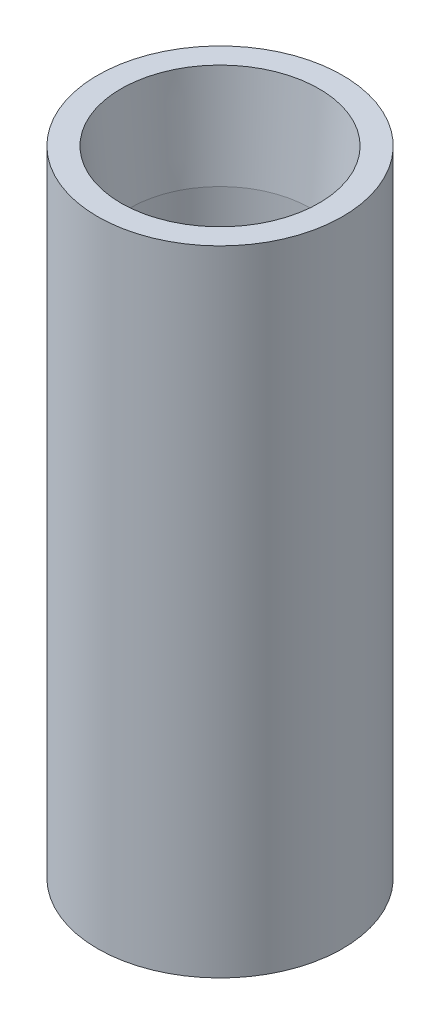
ISO-10303-21;
HEADER;
FILE_DESCRIPTION(('STEP AP214'),'2;1');
FILE_NAME('part.step','',(''),(''),'','','');
FILE_SCHEMA(('AUTOMOTIVE_DESIGN { 1 0 10303 214 1 1 1 1 }'));
ENDSEC;
DATA;
#1=APPLICATION_CONTEXT('core data for automotive mechanical design processes');
#2=APPLICATION_PROTOCOL_DEFINITION('international standard','automotive_design',2000,#1);
#3=PRODUCT_CONTEXT('',#1,'mechanical');
#4=PRODUCT('Part','Part','',(#3));
#5=PRODUCT_RELATED_PRODUCT_CATEGORY('part','',(#4));
#6=PRODUCT_DEFINITION_FORMATION('','',#4);
#7=PRODUCT_DEFINITION_CONTEXT('part definition',#1,'design');
#8=PRODUCT_DEFINITION('design','',#6,#7);
#9=PRODUCT_DEFINITION_SHAPE('','',#8);
#10=(LENGTH_UNIT() NAMED_UNIT(*) SI_UNIT(.MILLI.,.METRE.));
#11=(NAMED_UNIT(*) PLANE_ANGLE_UNIT() SI_UNIT($,.RADIAN.));
#12=(NAMED_UNIT(*) SI_UNIT($,.STERADIAN.) SOLID_ANGLE_UNIT());
#13=UNCERTAINTY_MEASURE_WITH_UNIT(LENGTH_MEASURE(1.E-05),#10,'distance_accuracy_value','');
#14=(GEOMETRIC_REPRESENTATION_CONTEXT(3) GLOBAL_UNCERTAINTY_ASSIGNED_CONTEXT((#13)) GLOBAL_UNIT_ASSIGNED_CONTEXT((#10,
#11,#12)) REPRESENTATION_CONTEXT('',''));
#15=CARTESIAN_POINT('',(0.,0.,0.));
#16=DIRECTION('',(0.,0.,1.));
#17=DIRECTION('',(1.,0.,0.));
#18=AXIS2_PLACEMENT_3D('',#15,#16,#17);
#19=CARTESIAN_POINT('',(0.,-81.28,0.));
#20=DIRECTION('',(0.,1.,0.));
#21=DIRECTION('',(0.,0.,1.));
#22=AXIS2_PLACEMENT_3D('',#19,#20,#21);
#23=CYLINDRICAL_SURFACE('',#22,15.7);
#24=CARTESIAN_POINT('',(0.,-81.28,0.));
#25=DIRECTION('',(0.,1.,0.));
#26=DIRECTION('',(0.,0.,1.));
#27=AXIS2_PLACEMENT_3D('',#24,#25,#26);
#28=CIRCLE('',#27,15.7);
#29=CARTESIAN_POINT('',(0.,-81.28,15.7));
#30=VERTEX_POINT('',#29);
#31=EDGE_CURVE('E10',#30,#30,#28,.T.);
#32=ORIENTED_EDGE('',*,*,#31,.T.);
#33=EDGE_LOOP('',(#32));
#34=FACE_BOUND('',#33,.T.);
#35=CARTESIAN_POINT('',(0.,0.,0.));
#36=DIRECTION('',(0.,1.,0.));
#37=DIRECTION('',(0.,0.,1.));
#38=AXIS2_PLACEMENT_3D('',#35,#36,#37);
#39=CIRCLE('',#38,15.7);
#40=CARTESIAN_POINT('',(0.,0.,15.7));
#41=VERTEX_POINT('',#40);
#42=EDGE_CURVE('E37',#41,#41,#39,.T.);
#43=ORIENTED_EDGE('',*,*,#42,.F.);
#44=EDGE_LOOP('',(#43));
#45=FACE_BOUND('',#44,.T.);
#46=ADVANCED_FACE('F33',(#34,#45),#23,.T.);
#47=CARTESIAN_POINT('',(0.,-81.28,0.));
#48=DIRECTION('',(0.,1.,0.));
#49=DIRECTION('',(0.,0.,1.));
#50=AXIS2_PLACEMENT_3D('',#47,#48,#49);
#51=PLANE('',#50);
#52=ORIENTED_EDGE('',*,*,#31,.F.);
#53=EDGE_LOOP('',(#52));
#54=FACE_BOUND('',#53,.T.);
#55=ADVANCED_FACE('F71',(#54),#51,.F.);
#56=CARTESIAN_POINT('',(0.,0.,0.));
#57=DIRECTION('',(0.,1.,0.));
#58=DIRECTION('',(0.,0.,1.));
#59=AXIS2_PLACEMENT_3D('',#56,#57,#58);
#60=PLANE('',#59);
#61=CARTESIAN_POINT('',(0.,0.,0.));
#62=DIRECTION('',(0.,1.,0.));
#63=DIRECTION('',(0.,0.,1.));
#64=AXIS2_PLACEMENT_3D('',#61,#62,#63);
#65=CIRCLE('',#64,12.7);
#66=CARTESIAN_POINT('',(0.,0.,12.7));
#67=VERTEX_POINT('',#66);
#68=EDGE_CURVE('E44',#67,#67,#65,.T.);
#69=ORIENTED_EDGE('',*,*,#68,.F.);
#70=EDGE_LOOP('',(#69));
#71=FACE_BOUND('',#70,.T.);
#72=ORIENTED_EDGE('',*,*,#42,.T.);
#73=EDGE_LOOP('',(#72));
#74=FACE_BOUND('',#73,.T.);
#75=ADVANCED_FACE('F35',(#71,#74),#60,.T.);
#76=CARTESIAN_POINT('',(0.,0.,0.));
#77=DIRECTION('',(0.,1.,0.));
#78=DIRECTION('',(0.,0.,1.));
#79=AXIS2_PLACEMENT_3D('',#76,#77,#78);
#80=CONICAL_SURFACE('',#79,12.7,0.0872664625997167);
#81=CARTESIAN_POINT('',(0.,-12.7,0.));
#82=DIRECTION('',(0.,1.,0.));
#83=DIRECTION('',(0.,0.,1.));
#84=AXIS2_PLACEMENT_3D('',#81,#82,#83);
#85=CIRCLE('',#84,11.5888939732208);
#86=CARTESIAN_POINT('',(0.,-12.7,11.5888939732208));
#87=VERTEX_POINT('',#86);
#88=EDGE_CURVE('E49',#87,#87,#85,.T.);
#89=ORIENTED_EDGE('',*,*,#88,.F.);
#90=EDGE_LOOP('',(#89));
#91=FACE_BOUND('',#90,.T.);
#92=ORIENTED_EDGE('',*,*,#68,.T.);
#93=EDGE_LOOP('',(#92));
#94=FACE_BOUND('',#93,.T.);
#95=ADVANCED_FACE('F60',(#91,#94),#80,.F.);
#96=CARTESIAN_POINT('',(0.,-76.2,0.));
#97=DIRECTION('',(0.,1.,0.));
#98=DIRECTION('',(0.,0.,1.));
#99=AXIS2_PLACEMENT_3D('',#96,#97,#98);
#100=CYLINDRICAL_SURFACE('',#99,11.5888939732208);
#101=CARTESIAN_POINT('',(0.,-76.2,0.));
#102=DIRECTION('',(0.,1.,0.));
#103=DIRECTION('',(0.,0.,1.));
#104=AXIS2_PLACEMENT_3D('',#101,#102,#103);
#105=CIRCLE('',#104,11.5888939732208);
#106=CARTESIAN_POINT('',(0.,-76.2,11.5888939732208));
#107=VERTEX_POINT('',#106);
#108=EDGE_CURVE('E48',#107,#107,#105,.T.);
#109=ORIENTED_EDGE('',*,*,#108,.F.);
#110=EDGE_LOOP('',(#109));
#111=FACE_BOUND('',#110,.T.);
#112=ORIENTED_EDGE('',*,*,#88,.T.);
#113=EDGE_LOOP('',(#112));
#114=FACE_BOUND('',#113,.T.);
#115=ADVANCED_FACE('F57',(#111,#114),#100,.F.);
#116=CARTESIAN_POINT('',(0.,-76.2,0.));
#117=DIRECTION('',(0.,1.,0.));
#118=DIRECTION('',(0.,0.,1.));
#119=AXIS2_PLACEMENT_3D('',#116,#117,#118);
#120=PLANE('',#119);
#121=ORIENTED_EDGE('',*,*,#108,.T.);
#122=EDGE_LOOP('',(#121));
#123=FACE_BOUND('',#122,.T.);
#124=ADVANCED_FACE('F55',(#123),#120,.T.);
#125=CLOSED_SHELL('',(#46,#55,#75,#95,#115,#124));
#126=MANIFOLD_SOLID_BREP('B2',#125);
#127=ADVANCED_BREP_SHAPE_REPRESENTATION('',(#18,#126),#14);
#128=SHAPE_DEFINITION_REPRESENTATION(#9,#127);
ENDSEC;
END-ISO-10303-21;
